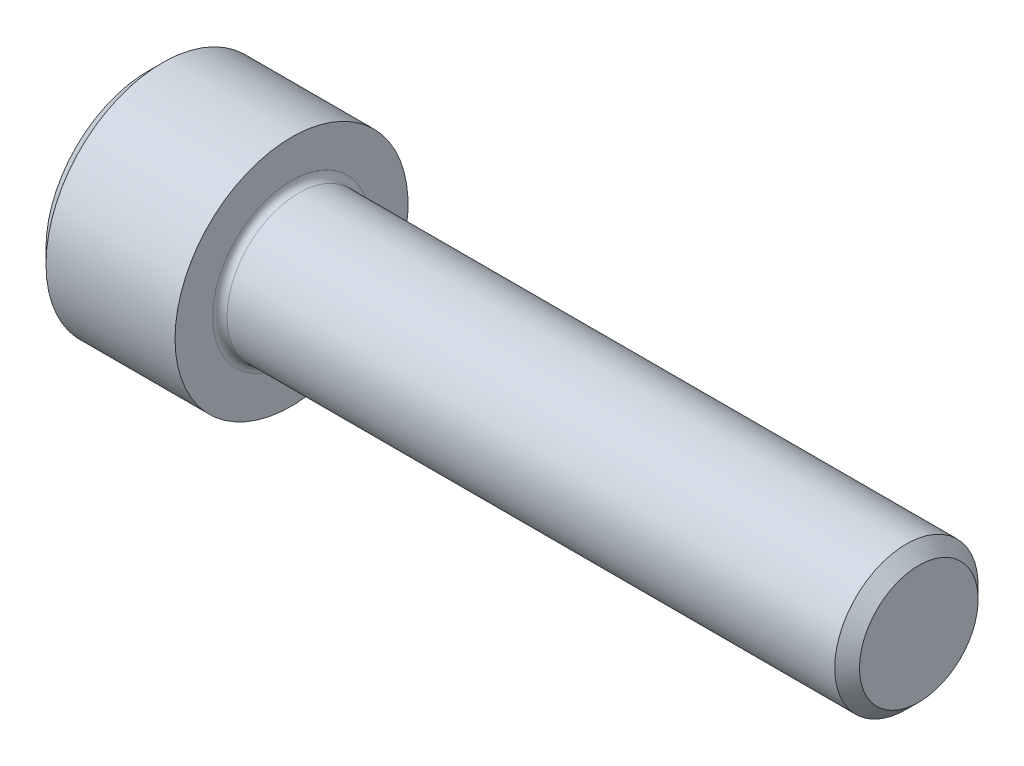
ISO-10303-21;
HEADER;
FILE_DESCRIPTION(('STEP AP214'),'2;1');
FILE_NAME('part.step','',(''),(''),'','','');
FILE_SCHEMA(('AUTOMOTIVE_DESIGN { 1 0 10303 214 1 1 1 1 }'));
ENDSEC;
DATA;
#1=APPLICATION_CONTEXT('core data for automotive mechanical design processes');
#2=APPLICATION_PROTOCOL_DEFINITION('international standard','automotive_design',2000,#1);
#3=PRODUCT_CONTEXT('',#1,'mechanical');
#4=PRODUCT('Part','Part','',(#3));
#5=PRODUCT_RELATED_PRODUCT_CATEGORY('part','',(#4));
#6=PRODUCT_DEFINITION_FORMATION('','',#4);
#7=PRODUCT_DEFINITION_CONTEXT('part definition',#1,'design');
#8=PRODUCT_DEFINITION('design','',#6,#7);
#9=PRODUCT_DEFINITION_SHAPE('','',#8);
#10=(LENGTH_UNIT() NAMED_UNIT(*) SI_UNIT(.MILLI.,.METRE.));
#11=(NAMED_UNIT(*) PLANE_ANGLE_UNIT() SI_UNIT($,.RADIAN.));
#12=(NAMED_UNIT(*) SI_UNIT($,.STERADIAN.) SOLID_ANGLE_UNIT());
#13=UNCERTAINTY_MEASURE_WITH_UNIT(LENGTH_MEASURE(1.E-05),#10,'distance_accuracy_value','');
#14=(GEOMETRIC_REPRESENTATION_CONTEXT(3) GLOBAL_UNCERTAINTY_ASSIGNED_CONTEXT((#13)) GLOBAL_UNIT_ASSIGNED_CONTEXT((#10,
#11,#12)) REPRESENTATION_CONTEXT('',''));
#15=CARTESIAN_POINT('',(0.,0.,0.));
#16=DIRECTION('',(0.,0.,1.));
#17=DIRECTION('',(1.,0.,0.));
#18=AXIS2_PLACEMENT_3D('',#15,#16,#17);
#19=CARTESIAN_POINT('',(0.,0.,0.));
#20=DIRECTION('',(-1.,0.,0.));
#21=DIRECTION('',(0.,0.,1.));
#22=AXIS2_PLACEMENT_3D('',#19,#20,#21);
#23=PLANE('',#22);
#24=DIRECTION('',(0.,-0.499999999999999,0.866025403784439));
#25=VECTOR('',#24,1.);
#26=CARTESIAN_POINT('',(0.,3.51894989071077,0.));
#27=LINE('',#26,#25);
#28=CARTESIAN_POINT('',(0.,3.51894989071077,0.));
#29=VERTEX_POINT('',#28);
#30=CARTESIAN_POINT('',(0.,1.75947494535539,3.0475));
#31=VERTEX_POINT('',#30);
#32=EDGE_CURVE('E276',#29,#31,#27,.T.);
#33=ORIENTED_EDGE('',*,*,#32,.T.);
#34=DIRECTION('',(0.,1.,0.));
#35=VECTOR('',#34,1.);
#36=CARTESIAN_POINT('',(0.,-1.75947494535538,3.0475));
#37=LINE('',#36,#35);
#38=CARTESIAN_POINT('',(0.,-1.75947494535538,3.0475));
#39=VERTEX_POINT('',#38);
#40=EDGE_CURVE('E140',#39,#31,#37,.T.);
#41=ORIENTED_EDGE('',*,*,#40,.F.);
#42=DIRECTION('',(0.,-0.500000000000001,-0.866025403784438));
#43=VECTOR('',#42,1.);
#44=CARTESIAN_POINT('',(0.,-1.75947494535538,3.0475));
#45=LINE('',#44,#43);
#46=CARTESIAN_POINT('',(0.,-3.51894989071077,0.));
#47=VERTEX_POINT('',#46);
#48=EDGE_CURVE('E284',#39,#47,#45,.T.);
#49=ORIENTED_EDGE('',*,*,#48,.T.);
#50=DIRECTION('',(0.,0.499999999999999,-0.866025403784439));
#51=VECTOR('',#50,1.);
#52=CARTESIAN_POINT('',(0.,-3.51894989071077,0.));
#53=LINE('',#52,#51);
#54=CARTESIAN_POINT('',(0.,-1.75947494535539,-3.0475));
#55=VERTEX_POINT('',#54);
#56=EDGE_CURVE('E283',#47,#55,#53,.T.);
#57=ORIENTED_EDGE('',*,*,#56,.T.);
#58=DIRECTION('',(0.,-1.,0.));
#59=VECTOR('',#58,1.);
#60=CARTESIAN_POINT('',(0.,1.75947494535538,-3.0475));
#61=LINE('',#60,#59);
#62=CARTESIAN_POINT('',(0.,1.75947494535538,-3.0475));
#63=VERTEX_POINT('',#62);
#64=EDGE_CURVE('E290',#63,#55,#61,.T.);
#65=ORIENTED_EDGE('',*,*,#64,.F.);
#66=DIRECTION('',(0.,-0.500000000000001,-0.866025403784438));
#67=VECTOR('',#66,1.);
#68=CARTESIAN_POINT('',(0.,3.51894989071077,0.));
#69=LINE('',#68,#67);
#70=EDGE_CURVE('E131',#29,#63,#69,.T.);
#71=ORIENTED_EDGE('',*,*,#70,.F.);
#72=EDGE_LOOP('',(#33,#41,#49,#57,#65,#71));
#73=FACE_BOUND('',#72,.T.);
#74=CARTESIAN_POINT('',(0.,0.,0.));
#75=DIRECTION('',(-1.,0.,0.));
#76=DIRECTION('',(0.,0.,1.));
#77=AXIS2_PLACEMENT_3D('',#74,#75,#76);
#78=CIRCLE('',#77,5.7);
#79=CARTESIAN_POINT('',(0.,0.,5.7));
#80=VERTEX_POINT('',#79);
#81=EDGE_CURVE('E163',#80,#80,#78,.T.);
#82=ORIENTED_EDGE('',*,*,#81,.T.);
#83=EDGE_LOOP('',(#82));
#84=FACE_BOUND('',#83,.T.);
#85=ADVANCED_FACE('F44',(#73,#84),#23,.T.);
#86=CARTESIAN_POINT('',(0.,0.,0.));
#87=DIRECTION('',(1.,0.,0.));
#88=DIRECTION('',(0.,0.,-1.));
#89=AXIS2_PLACEMENT_3D('',#86,#87,#88);
#90=CONICAL_SURFACE('',#89,5.7,0.785398163397448);
#91=CARTESIAN_POINT('',(0.800000000000002,0.,0.));
#92=DIRECTION('',(-1.,0.,0.));
#93=DIRECTION('',(0.,0.,1.));
#94=AXIS2_PLACEMENT_3D('',#91,#92,#93);
#95=CIRCLE('',#94,6.5);
#96=CARTESIAN_POINT('',(0.800000000000002,0.,6.5));
#97=VERTEX_POINT('',#96);
#98=EDGE_CURVE('E158',#97,#97,#95,.T.);
#99=ORIENTED_EDGE('',*,*,#98,.T.);
#100=EDGE_LOOP('',(#99));
#101=FACE_BOUND('',#100,.T.);
#102=ORIENTED_EDGE('',*,*,#81,.F.);
#103=EDGE_LOOP('',(#102));
#104=FACE_BOUND('',#103,.T.);
#105=ADVANCED_FACE('F182',(#101,#104),#90,.T.);
#106=CARTESIAN_POINT('',(-31.75,0.,0.));
#107=DIRECTION('',(-1.,0.,0.));
#108=DIRECTION('',(0.,0.,1.));
#109=AXIS2_PLACEMENT_3D('',#106,#107,#108);
#110=CYLINDRICAL_SURFACE('',#109,6.5);
#111=CARTESIAN_POINT('',(7.99999999999999,0.,0.));
#112=DIRECTION('',(-1.,0.,0.));
#113=DIRECTION('',(0.,0.,1.));
#114=AXIS2_PLACEMENT_3D('',#111,#112,#113);
#115=CIRCLE('',#114,6.5);
#116=CARTESIAN_POINT('',(7.99999999999999,0.,6.5));
#117=VERTEX_POINT('',#116);
#118=EDGE_CURVE('E152',#117,#117,#115,.T.);
#119=ORIENTED_EDGE('',*,*,#118,.T.);
#120=EDGE_LOOP('',(#119));
#121=FACE_BOUND('',#120,.T.);
#122=ORIENTED_EDGE('',*,*,#98,.F.);
#123=EDGE_LOOP('',(#122));
#124=FACE_BOUND('',#123,.T.);
#125=ADVANCED_FACE('F189',(#121,#124),#110,.T.);
#126=CARTESIAN_POINT('',(8.,6.5,0.));
#127=DIRECTION('',(1.,0.,0.));
#128=DIRECTION('',(0.,0.,-1.));
#129=AXIS2_PLACEMENT_3D('',#126,#127,#128);
#130=PLANE('',#129);
#131=CARTESIAN_POINT('',(8.,0.,0.));
#132=DIRECTION('',(1.,0.,0.));
#133=DIRECTION('',(0.,0.,-1.));
#134=AXIS2_PLACEMENT_3D('',#131,#132,#133);
#135=CIRCLE('',#134,4.40000000000003);
#136=CARTESIAN_POINT('',(8.,0.,-4.40000000000003));
#137=VERTEX_POINT('',#136);
#138=EDGE_CURVE('E52',#137,#137,#135,.F.);
#139=ORIENTED_EDGE('',*,*,#138,.T.);
#140=EDGE_LOOP('',(#139));
#141=FACE_BOUND('',#140,.T.);
#142=ORIENTED_EDGE('',*,*,#118,.F.);
#143=EDGE_LOOP('',(#142));
#144=FACE_BOUND('',#143,.T.);
#145=ADVANCED_FACE('F168',(#141,#144),#130,.T.);
#146=CARTESIAN_POINT('',(-31.75,0.,0.));
#147=DIRECTION('',(-1.,0.,0.));
#148=DIRECTION('',(0.,0.,1.));
#149=AXIS2_PLACEMENT_3D('',#146,#147,#148);
#150=CYLINDRICAL_SURFACE('',#149,4.00000000000003);
#151=CARTESIAN_POINT('',(8.4,0.,0.));
#152=DIRECTION('',(1.,0.,0.));
#153=DIRECTION('',(0.,0.,-1.));
#154=AXIS2_PLACEMENT_3D('',#151,#152,#153);
#155=CIRCLE('',#154,4.00000000000003);
#156=CARTESIAN_POINT('',(8.4,0.,-4.00000000000003));
#157=VERTEX_POINT('',#156);
#158=EDGE_CURVE('E11',#157,#157,#155,.T.);
#159=ORIENTED_EDGE('',*,*,#158,.T.);
#160=EDGE_LOOP('',(#159));
#161=FACE_BOUND('',#160,.T.);
#162=CARTESIAN_POINT('',(42.3095000000001,0.,0.));
#163=DIRECTION('',(-1.,0.,0.));
#164=DIRECTION('',(0.,0.,1.));
#165=AXIS2_PLACEMENT_3D('',#162,#163,#164);
#166=CIRCLE('',#165,4.00000000000006);
#167=CARTESIAN_POINT('',(42.3095000000001,0.,4.00000000000006));
#168=VERTEX_POINT('',#167);
#169=EDGE_CURVE('E151',#168,#168,#166,.T.);
#170=ORIENTED_EDGE('',*,*,#169,.T.);
#171=EDGE_LOOP('',(#170));
#172=FACE_BOUND('',#171,.T.);
#173=ADVANCED_FACE('F200',(#161,#172),#150,.T.);
#174=CARTESIAN_POINT('',(43.,0.,0.));
#175=DIRECTION('',(-1.,0.,0.));
#176=DIRECTION('',(0.,0.,1.));
#177=AXIS2_PLACEMENT_3D('',#174,#175,#176);
#178=CONICAL_SURFACE('',#177,3.3095,0.785398163397565);
#179=ORIENTED_EDGE('',*,*,#169,.F.);
#180=EDGE_LOOP('',(#179));
#181=FACE_BOUND('',#180,.T.);
#182=CARTESIAN_POINT('',(43.,0.,0.));
#183=DIRECTION('',(-1.,0.,0.));
#184=DIRECTION('',(0.,0.,1.));
#185=AXIS2_PLACEMENT_3D('',#182,#183,#184);
#186=CIRCLE('',#185,3.3095);
#187=CARTESIAN_POINT('',(43.,0.,3.3095));
#188=VERTEX_POINT('',#187);
#189=EDGE_CURVE('E146',#188,#188,#186,.T.);
#190=ORIENTED_EDGE('',*,*,#189,.T.);
#191=EDGE_LOOP('',(#190));
#192=FACE_BOUND('',#191,.T.);
#193=ADVANCED_FACE('F177',(#181,#192),#178,.T.);
#194=CARTESIAN_POINT('',(43.,3.3095,0.));
#195=DIRECTION('',(1.,0.,0.));
#196=DIRECTION('',(0.,0.,-1.));
#197=AXIS2_PLACEMENT_3D('',#194,#195,#196);
#198=PLANE('',#197);
#199=ORIENTED_EDGE('',*,*,#189,.F.);
#200=EDGE_LOOP('',(#199));
#201=FACE_BOUND('',#200,.T.);
#202=ADVANCED_FACE('F167',(#201),#198,.T.);
#203=CARTESIAN_POINT('',(8.4,0.,0.));
#204=DIRECTION('',(1.,0.,0.));
#205=DIRECTION('',(0.,0.,-1.));
#206=AXIS2_PLACEMENT_3D('',#203,#204,#205);
#207=TOROIDAL_SURFACE('',#206,4.40000000000003,0.4);
#208=ORIENTED_EDGE('',*,*,#158,.F.);
#209=EDGE_LOOP('',(#208));
#210=FACE_BOUND('',#209,.T.);
#211=ORIENTED_EDGE('',*,*,#138,.F.);
#212=EDGE_LOOP('',(#211));
#213=FACE_BOUND('',#212,.T.);
#214=ADVANCED_FACE('F50',(#210,#213),#207,.F.);
#215=CARTESIAN_POINT('',(4.,3.51894989071077,0.));
#216=DIRECTION('',(0.,-0.866025403784439,-0.499999999999999));
#217=DIRECTION('',(0.,0.499999999999999,-0.866025403784439));
#218=AXIS2_PLACEMENT_3D('',#215,#216,#217);
#219=PLANE('',#218);
#220=ORIENTED_EDGE('',*,*,#32,.F.);
#221=DIRECTION('',(-1.,0.,0.));
#222=VECTOR('',#221,1.);
#223=CARTESIAN_POINT('',(4.,3.51894989071077,0.));
#224=LINE('',#223,#222);
#225=CARTESIAN_POINT('',(4.,3.51894989071077,0.));
#226=VERTEX_POINT('',#225);
#227=EDGE_CURVE('E280',#226,#29,#224,.T.);
#228=ORIENTED_EDGE('',*,*,#227,.F.);
#229=DIRECTION('',(0.,-0.499999999999999,0.866025403784439));
#230=VECTOR('',#229,1.);
#231=CARTESIAN_POINT('',(4.,3.51894989071077,0.));
#232=LINE('',#231,#230);
#233=CARTESIAN_POINT('',(3.99999999999999,2.63921241803308,1.52375));
#234=VERTEX_POINT('',#233);
#235=EDGE_CURVE('E58',#226,#234,#232,.T.);
#236=ORIENTED_EDGE('',*,*,#235,.T.);
#237=CARTESIAN_POINT('',(4.,1.75947494535539,3.0475));
#238=VERTEX_POINT('',#237);
#239=EDGE_CURVE('E117',#234,#238,#232,.T.);
#240=ORIENTED_EDGE('',*,*,#239,.T.);
#241=DIRECTION('',(-1.,0.,0.));
#242=VECTOR('',#241,1.);
#243=CARTESIAN_POINT('',(4.,1.75947494535539,3.0475));
#244=LINE('',#243,#242);
#245=EDGE_CURVE('E127',#238,#31,#244,.T.);
#246=ORIENTED_EDGE('',*,*,#245,.T.);
#247=EDGE_LOOP('',(#220,#228,#236,#240,#246));
#248=FACE_BOUND('',#247,.T.);
#249=ADVANCED_FACE('F129',(#248),#219,.T.);
#250=CARTESIAN_POINT('',(4.,-1.75947494535538,3.0475));
#251=DIRECTION('',(0.,0.,1.));
#252=DIRECTION('',(0.,-1.,0.));
#253=AXIS2_PLACEMENT_3D('',#250,#251,#252);
#254=PLANE('',#253);
#255=ORIENTED_EDGE('',*,*,#40,.T.);
#256=ORIENTED_EDGE('',*,*,#245,.F.);
#257=DIRECTION('',(0.,1.,0.));
#258=VECTOR('',#257,1.);
#259=CARTESIAN_POINT('',(4.,-1.75947494535538,3.0475));
#260=LINE('',#259,#258);
#261=CARTESIAN_POINT('',(4.,0.,3.0475));
#262=VERTEX_POINT('',#261);
#263=EDGE_CURVE('E116',#262,#238,#260,.T.);
#264=ORIENTED_EDGE('',*,*,#263,.F.);
#265=CARTESIAN_POINT('',(4.,-1.75947494535538,3.0475));
#266=VERTEX_POINT('',#265);
#267=EDGE_CURVE('E128',#266,#262,#260,.T.);
#268=ORIENTED_EDGE('',*,*,#267,.F.);
#269=DIRECTION('',(-1.,0.,0.));
#270=VECTOR('',#269,1.);
#271=CARTESIAN_POINT('',(4.,-1.75947494535538,3.0475));
#272=LINE('',#271,#270);
#273=EDGE_CURVE('E139',#266,#39,#272,.T.);
#274=ORIENTED_EDGE('',*,*,#273,.T.);
#275=EDGE_LOOP('',(#255,#256,#264,#268,#274));
#276=FACE_BOUND('',#275,.T.);
#277=ADVANCED_FACE('F133',(#276),#254,.F.);
#278=CARTESIAN_POINT('',(4.,-1.75947494535538,3.0475));
#279=DIRECTION('',(0.,0.866025403784438,-0.500000000000001));
#280=DIRECTION('',(0.,0.500000000000001,0.866025403784438));
#281=AXIS2_PLACEMENT_3D('',#278,#279,#280);
#282=PLANE('',#281);
#283=ORIENTED_EDGE('',*,*,#48,.F.);
#284=ORIENTED_EDGE('',*,*,#273,.F.);
#285=DIRECTION('',(0.,-0.500000000000001,-0.866025403784438));
#286=VECTOR('',#285,1.);
#287=CARTESIAN_POINT('',(4.,-1.75947494535538,3.0475));
#288=LINE('',#287,#286);
#289=CARTESIAN_POINT('',(4.,-2.63921241803307,1.52375));
#290=VERTEX_POINT('',#289);
#291=EDGE_CURVE('E256',#266,#290,#288,.T.);
#292=ORIENTED_EDGE('',*,*,#291,.T.);
#293=CARTESIAN_POINT('',(4.,-3.51894989071077,0.));
#294=VERTEX_POINT('',#293);
#295=EDGE_CURVE('E257',#290,#294,#288,.T.);
#296=ORIENTED_EDGE('',*,*,#295,.T.);
#297=DIRECTION('',(-1.,0.,0.));
#298=VECTOR('',#297,1.);
#299=CARTESIAN_POINT('',(4.,-3.51894989071077,0.));
#300=LINE('',#299,#298);
#301=EDGE_CURVE('E144',#294,#47,#300,.T.);
#302=ORIENTED_EDGE('',*,*,#301,.T.);
#303=EDGE_LOOP('',(#283,#284,#292,#296,#302));
#304=FACE_BOUND('',#303,.T.);
#305=ADVANCED_FACE('F208',(#304),#282,.T.);
#306=CARTESIAN_POINT('',(4.,-3.51894989071077,0.));
#307=DIRECTION('',(0.,0.866025403784439,0.499999999999999));
#308=DIRECTION('',(0.,-0.499999999999999,0.866025403784439));
#309=AXIS2_PLACEMENT_3D('',#306,#307,#308);
#310=PLANE('',#309);
#311=ORIENTED_EDGE('',*,*,#56,.F.);
#312=ORIENTED_EDGE('',*,*,#301,.F.);
#313=DIRECTION('',(0.,0.499999999999999,-0.866025403784439));
#314=VECTOR('',#313,1.);
#315=CARTESIAN_POINT('',(4.,-3.51894989071077,0.));
#316=LINE('',#315,#314);
#317=CARTESIAN_POINT('',(4.,-2.63921241803308,-1.52375));
#318=VERTEX_POINT('',#317);
#319=EDGE_CURVE('E265',#294,#318,#316,.T.);
#320=ORIENTED_EDGE('',*,*,#319,.T.);
#321=CARTESIAN_POINT('',(4.,-1.75947494535539,-3.0475));
#322=VERTEX_POINT('',#321);
#323=EDGE_CURVE('E270',#318,#322,#316,.T.);
#324=ORIENTED_EDGE('',*,*,#323,.T.);
#325=DIRECTION('',(-1.,0.,0.));
#326=VECTOR('',#325,1.);
#327=CARTESIAN_POINT('',(4.,-1.75947494535539,-3.0475));
#328=LINE('',#327,#326);
#329=EDGE_CURVE('E298',#322,#55,#328,.T.);
#330=ORIENTED_EDGE('',*,*,#329,.T.);
#331=EDGE_LOOP('',(#311,#312,#320,#324,#330));
#332=FACE_BOUND('',#331,.T.);
#333=ADVANCED_FACE('F211',(#332),#310,.T.);
#334=CARTESIAN_POINT('',(4.,1.75947494535538,-3.0475));
#335=DIRECTION('',(0.,0.,-1.));
#336=DIRECTION('',(0.,1.,0.));
#337=AXIS2_PLACEMENT_3D('',#334,#335,#336);
#338=PLANE('',#337);
#339=ORIENTED_EDGE('',*,*,#64,.T.);
#340=ORIENTED_EDGE('',*,*,#329,.F.);
#341=DIRECTION('',(0.,-1.,0.));
#342=VECTOR('',#341,1.);
#343=CARTESIAN_POINT('',(4.,1.75947494535538,-3.0475));
#344=LINE('',#343,#342);
#345=CARTESIAN_POINT('',(4.,0.,-3.0475));
#346=VERTEX_POINT('',#345);
#347=EDGE_CURVE('E272',#346,#322,#344,.T.);
#348=ORIENTED_EDGE('',*,*,#347,.F.);
#349=CARTESIAN_POINT('',(4.,1.75947494535538,-3.0475));
#350=VERTEX_POINT('',#349);
#351=EDGE_CURVE('E275',#350,#346,#344,.T.);
#352=ORIENTED_EDGE('',*,*,#351,.F.);
#353=DIRECTION('',(-1.,0.,0.));
#354=VECTOR('',#353,1.);
#355=CARTESIAN_POINT('',(4.,1.75947494535538,-3.0475));
#356=LINE('',#355,#354);
#357=EDGE_CURVE('E291',#350,#63,#356,.T.);
#358=ORIENTED_EDGE('',*,*,#357,.T.);
#359=EDGE_LOOP('',(#339,#340,#348,#352,#358));
#360=FACE_BOUND('',#359,.T.);
#361=ADVANCED_FACE('F216',(#360),#338,.F.);
#362=CARTESIAN_POINT('',(4.,3.51894989071077,0.));
#363=DIRECTION('',(0.,0.866025403784438,-0.500000000000001));
#364=DIRECTION('',(0.,0.500000000000001,0.866025403784438));
#365=AXIS2_PLACEMENT_3D('',#362,#363,#364);
#366=PLANE('',#365);
#367=ORIENTED_EDGE('',*,*,#70,.T.);
#368=ORIENTED_EDGE('',*,*,#357,.F.);
#369=DIRECTION('',(0.,-0.500000000000001,-0.866025403784438));
#370=VECTOR('',#369,1.);
#371=CARTESIAN_POINT('',(4.,3.51894989071077,0.));
#372=LINE('',#371,#370);
#373=CARTESIAN_POINT('',(4.,2.63921241803308,-1.52375));
#374=VERTEX_POINT('',#373);
#375=EDGE_CURVE('E273',#374,#350,#372,.T.);
#376=ORIENTED_EDGE('',*,*,#375,.F.);
#377=EDGE_CURVE('E248',#226,#374,#372,.T.);
#378=ORIENTED_EDGE('',*,*,#377,.F.);
#379=ORIENTED_EDGE('',*,*,#227,.T.);
#380=EDGE_LOOP('',(#367,#368,#376,#378,#379));
#381=FACE_BOUND('',#380,.T.);
#382=ADVANCED_FACE('F222',(#381),#366,.F.);
#383=CARTESIAN_POINT('',(4.,1.75947494535539,3.0475));
#384=DIRECTION('',(-1.,0.,0.));
#385=DIRECTION('',(0.,0.,1.));
#386=AXIS2_PLACEMENT_3D('',#383,#384,#385);
#387=PLANE('',#386);
#388=CARTESIAN_POINT('',(3.99999999999999,0.,0.));
#389=DIRECTION('',(-1.,0.,0.));
#390=DIRECTION('',(0.,0.,1.));
#391=AXIS2_PLACEMENT_3D('',#388,#389,#390);
#392=CIRCLE('',#391,3.0475);
#393=EDGE_CURVE('E138',#290,#262,#392,.T.);
#394=ORIENTED_EDGE('',*,*,#393,.F.);
#395=ORIENTED_EDGE('',*,*,#291,.F.);
#396=ORIENTED_EDGE('',*,*,#267,.T.);
#397=EDGE_LOOP('',(#394,#395,#396));
#398=FACE_BOUND('',#397,.T.);
#399=ADVANCED_FACE('F221',(#398),#387,.T.);
#400=EDGE_CURVE('E145',#318,#290,#392,.T.);
#401=ORIENTED_EDGE('',*,*,#400,.F.);
#402=ORIENTED_EDGE('',*,*,#319,.F.);
#403=ORIENTED_EDGE('',*,*,#295,.F.);
#404=EDGE_LOOP('',(#401,#402,#403));
#405=FACE_BOUND('',#404,.T.);
#406=ADVANCED_FACE('F226',(#405),#387,.T.);
#407=EDGE_CURVE('E305',#346,#318,#392,.T.);
#408=ORIENTED_EDGE('',*,*,#407,.F.);
#409=ORIENTED_EDGE('',*,*,#347,.T.);
#410=ORIENTED_EDGE('',*,*,#323,.F.);
#411=EDGE_LOOP('',(#408,#409,#410));
#412=FACE_BOUND('',#411,.T.);
#413=ADVANCED_FACE('F231',(#412),#387,.T.);
#414=EDGE_CURVE('E255',#374,#346,#392,.T.);
#415=ORIENTED_EDGE('',*,*,#414,.F.);
#416=ORIENTED_EDGE('',*,*,#375,.T.);
#417=ORIENTED_EDGE('',*,*,#351,.T.);
#418=EDGE_LOOP('',(#415,#416,#417));
#419=FACE_BOUND('',#418,.T.);
#420=ADVANCED_FACE('F239',(#419),#387,.T.);
#421=EDGE_CURVE('E149',#234,#374,#392,.T.);
#422=ORIENTED_EDGE('',*,*,#421,.F.);
#423=ORIENTED_EDGE('',*,*,#235,.F.);
#424=ORIENTED_EDGE('',*,*,#377,.T.);
#425=EDGE_LOOP('',(#422,#423,#424));
#426=FACE_BOUND('',#425,.T.);
#427=ADVANCED_FACE('F236',(#426),#387,.T.);
#428=EDGE_CURVE('E122',#262,#234,#392,.T.);
#429=ORIENTED_EDGE('',*,*,#428,.F.);
#430=ORIENTED_EDGE('',*,*,#263,.T.);
#431=ORIENTED_EDGE('',*,*,#239,.F.);
#432=EDGE_LOOP('',(#429,#430,#431));
#433=FACE_BOUND('',#432,.T.);
#434=ADVANCED_FACE('F120',(#433),#387,.T.);
#435=CARTESIAN_POINT('',(3.99999999999999,0.,0.));
#436=DIRECTION('',(-1.,0.,0.));
#437=DIRECTION('',(0.,0.,1.));
#438=AXIS2_PLACEMENT_3D('',#435,#436,#437);
#439=CONICAL_SURFACE('',#438,3.0475,1.04719755119659);
#440=CARTESIAN_POINT('',(5.75947494535539,0.,0.));
#441=VERTEX_POINT('',#440);
#442=VERTEX_LOOP('',#441);
#443=FACE_BOUND('',#442,.T.);
#444=ORIENTED_EDGE('',*,*,#428,.T.);
#445=ORIENTED_EDGE('',*,*,#421,.T.);
#446=ORIENTED_EDGE('',*,*,#414,.T.);
#447=ORIENTED_EDGE('',*,*,#407,.T.);
#448=ORIENTED_EDGE('',*,*,#400,.T.);
#449=ORIENTED_EDGE('',*,*,#393,.T.);
#450=EDGE_LOOP('',(#444,#445,#446,#447,#448,#449));
#451=FACE_BOUND('',#450,.T.);
#452=ADVANCED_FACE('F201',(#443,#451),#439,.F.);
#453=CLOSED_SHELL('',(#85,#105,#125,#145,#173,#193,#202,#214,#249,#277,#305,#333,#361,#382,#399,
#406,#413,#420,#427,#434,#452));
#454=MANIFOLD_SOLID_BREP('B2',#453);
#455=ADVANCED_BREP_SHAPE_REPRESENTATION('',(#18,#454),#14);
#456=SHAPE_DEFINITION_REPRESENTATION(#9,#455);
ENDSEC;
END-ISO-10303-21;
